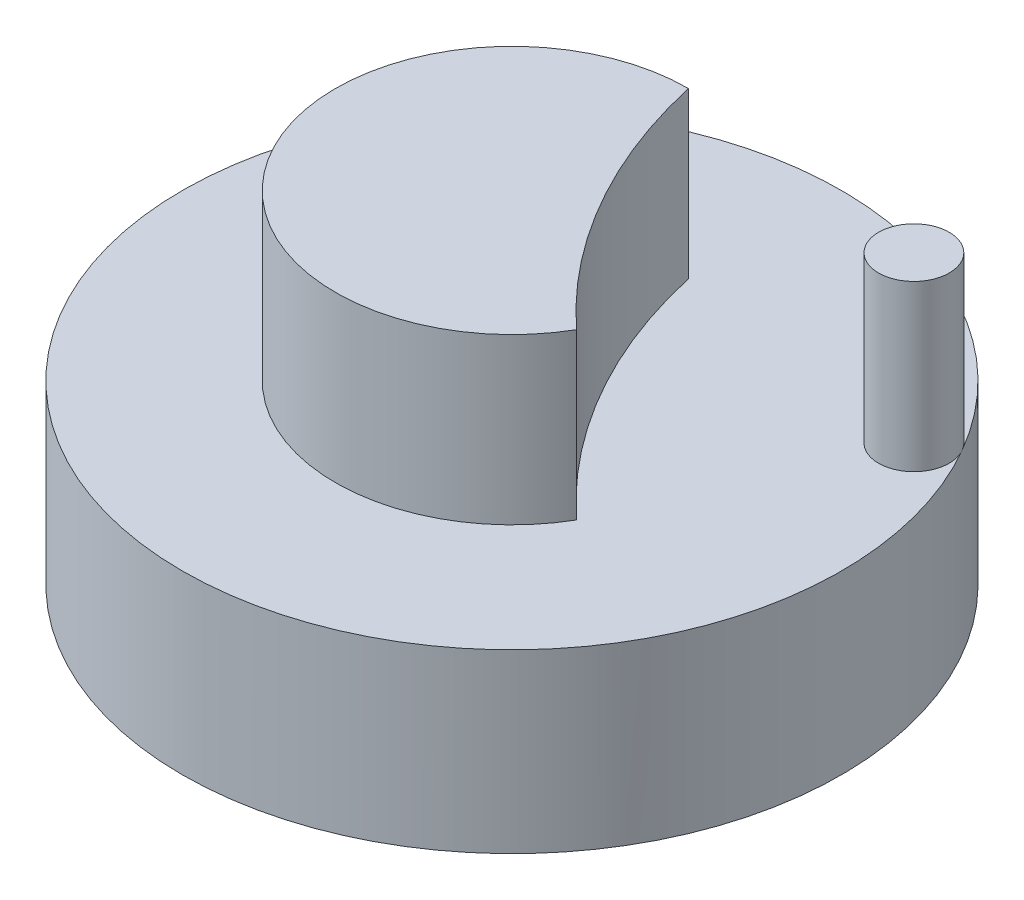
ISO-10303-21;
HEADER;
FILE_DESCRIPTION(('STEP AP214'),'2;1');
FILE_NAME('part.step','',(''),(''),'','','');
FILE_SCHEMA(('AUTOMOTIVE_DESIGN { 1 0 10303 214 1 1 1 1 }'));
ENDSEC;
DATA;
#1=APPLICATION_CONTEXT('core data for automotive mechanical design processes');
#2=APPLICATION_PROTOCOL_DEFINITION('international standard','automotive_design',2000,#1);
#3=PRODUCT_CONTEXT('',#1,'mechanical');
#4=PRODUCT('Part','Part','',(#3));
#5=PRODUCT_RELATED_PRODUCT_CATEGORY('part','',(#4));
#6=PRODUCT_DEFINITION_FORMATION('','',#4);
#7=PRODUCT_DEFINITION_CONTEXT('part definition',#1,'design');
#8=PRODUCT_DEFINITION('design','',#6,#7);
#9=PRODUCT_DEFINITION_SHAPE('','',#8);
#10=(LENGTH_UNIT() NAMED_UNIT(*) SI_UNIT(.MILLI.,.METRE.));
#11=(NAMED_UNIT(*) PLANE_ANGLE_UNIT() SI_UNIT($,.RADIAN.));
#12=(NAMED_UNIT(*) SI_UNIT($,.STERADIAN.) SOLID_ANGLE_UNIT());
#13=UNCERTAINTY_MEASURE_WITH_UNIT(LENGTH_MEASURE(1.E-05),#10,'distance_accuracy_value','');
#14=(GEOMETRIC_REPRESENTATION_CONTEXT(3) GLOBAL_UNCERTAINTY_ASSIGNED_CONTEXT((#13)) GLOBAL_UNIT_ASSIGNED_CONTEXT((#10,
#11,#12)) REPRESENTATION_CONTEXT('',''));
#15=CARTESIAN_POINT('',(0.,0.,0.));
#16=DIRECTION('',(0.,0.,1.));
#17=DIRECTION('',(1.,0.,0.));
#18=AXIS2_PLACEMENT_3D('',#15,#16,#17);
#19=CARTESIAN_POINT('',(84.7241393230111,28.,51.084495355));
#20=DIRECTION('',(0.,-1.,0.));
#21=DIRECTION('',(0.,0.,-1.));
#22=AXIS2_PLACEMENT_3D('',#19,#20,#21);
#23=CYLINDRICAL_SURFACE('',#22,86.81);
#24=CARTESIAN_POINT('',(84.7241393230111,0.,51.084495355));
#25=DIRECTION('',(0.,1.,0.));
#26=DIRECTION('',(0.,0.,1.));
#27=AXIS2_PLACEMENT_3D('',#24,#25,#26);
#28=CIRCLE('',#27,86.81);
#29=CARTESIAN_POINT('',(0.,0.,70.));
#30=VERTEX_POINT('',#29);
#31=CARTESIAN_POINT('',(25.9807621135332,0.,115.));
#32=VERTEX_POINT('',#31);
#33=EDGE_CURVE('E77',#30,#32,#28,.T.);
#34=ORIENTED_EDGE('',*,*,#33,.F.);
#35=DIRECTION('',(0.,-1.,0.));
#36=VECTOR('',#35,1.);
#37=CARTESIAN_POINT('',(0.,28.,70.));
#38=LINE('',#37,#36);
#39=CARTESIAN_POINT('',(0.,28.,70.));
#40=VERTEX_POINT('',#39);
#41=EDGE_CURVE('E11',#40,#30,#38,.T.);
#42=ORIENTED_EDGE('',*,*,#41,.F.);
#43=CARTESIAN_POINT('',(84.7241393230111,28.,51.084495355));
#44=DIRECTION('',(0.,1.,0.));
#45=DIRECTION('',(0.,0.,1.));
#46=AXIS2_PLACEMENT_3D('',#43,#44,#45);
#47=CIRCLE('',#46,86.81);
#48=CARTESIAN_POINT('',(25.9807621135332,28.,115.));
#49=VERTEX_POINT('',#48);
#50=EDGE_CURVE('E83',#40,#49,#47,.T.);
#51=ORIENTED_EDGE('',*,*,#50,.T.);
#52=DIRECTION('',(0.,-1.,0.));
#53=VECTOR('',#52,1.);
#54=CARTESIAN_POINT('',(25.9807621135332,28.,115.));
#55=LINE('',#54,#53);
#56=EDGE_CURVE('E54',#49,#32,#55,.T.);
#57=ORIENTED_EDGE('',*,*,#56,.T.);
#58=EDGE_LOOP('',(#34,#42,#51,#57));
#59=FACE_BOUND('',#58,.T.);
#60=ADVANCED_FACE('F47',(#59),#23,.F.);
#61=CARTESIAN_POINT('',(0.,28.,100.));
#62=DIRECTION('',(0.,-1.,0.));
#63=DIRECTION('',(0.,0.,-1.));
#64=AXIS2_PLACEMENT_3D('',#61,#62,#63);
#65=CYLINDRICAL_SURFACE('',#64,30.);
#66=CARTESIAN_POINT('',(0.,0.,100.));
#67=DIRECTION('',(0.,1.,0.));
#68=DIRECTION('',(0.,0.,1.));
#69=AXIS2_PLACEMENT_3D('',#66,#67,#68);
#70=CIRCLE('',#69,30.);
#71=EDGE_CURVE('E80',#30,#32,#70,.T.);
#72=ORIENTED_EDGE('',*,*,#71,.T.);
#73=ORIENTED_EDGE('',*,*,#56,.F.);
#74=CARTESIAN_POINT('',(0.,28.,100.));
#75=DIRECTION('',(0.,1.,0.));
#76=DIRECTION('',(0.,0.,1.));
#77=AXIS2_PLACEMENT_3D('',#74,#75,#76);
#78=CIRCLE('',#77,30.);
#79=EDGE_CURVE('E66',#40,#49,#78,.T.);
#80=ORIENTED_EDGE('',*,*,#79,.F.);
#81=ORIENTED_EDGE('',*,*,#41,.T.);
#82=EDGE_LOOP('',(#72,#73,#80,#81));
#83=FACE_BOUND('',#82,.T.);
#84=ADVANCED_FACE('F85',(#83),#65,.T.);
#85=CARTESIAN_POINT('',(0.,28.,0.));
#86=DIRECTION('',(0.,1.,0.));
#87=DIRECTION('',(0.,0.,1.));
#88=AXIS2_PLACEMENT_3D('',#85,#86,#87);
#89=PLANE('',#88);
#90=ORIENTED_EDGE('',*,*,#50,.F.);
#91=ORIENTED_EDGE('',*,*,#79,.T.);
#92=EDGE_LOOP('',(#90,#91));
#93=FACE_BOUND('',#92,.T.);
#94=ADVANCED_FACE('F132',(#93),#89,.T.);
#95=CARTESIAN_POINT('',(0.,0.,100.));
#96=DIRECTION('',(0.,1.,0.));
#97=DIRECTION('',(0.,0.,1.));
#98=AXIS2_PLACEMENT_3D('',#95,#96,#97);
#99=PLANE('',#98);
#100=CARTESIAN_POINT('',(0.,0.,100.));
#101=DIRECTION('',(0.,1.,0.));
#102=DIRECTION('',(0.,0.,1.));
#103=AXIS2_PLACEMENT_3D('',#100,#101,#102);
#104=CIRCLE('',#103,56.0000000000003);
#105=CARTESIAN_POINT('',(48.4974226119286,0.,71.9999999999996));
#106=VERTEX_POINT('',#105);
#107=EDGE_CURVE('E91',#106,#106,#104,.T.);
#108=ORIENTED_EDGE('',*,*,#107,.T.);
#109=CARTESIAN_POINT('',(43.3012701892218,0.,74.9999999999997));
#110=DIRECTION('',(0.,1.,0.));
#111=DIRECTION('',(0.,0.,1.));
#112=AXIS2_PLACEMENT_3D('',#109,#110,#111);
#113=CIRCLE('',#112,5.99999999999997);
#114=EDGE_CURVE('E59',#106,#106,#113,.T.);
#115=ORIENTED_EDGE('',*,*,#114,.F.);
#116=EDGE_LOOP('',(#108,#115));
#117=FACE_BOUND('',#116,.T.);
#118=ORIENTED_EDGE('',*,*,#71,.F.);
#119=ORIENTED_EDGE('',*,*,#33,.T.);
#120=EDGE_LOOP('',(#118,#119));
#121=FACE_BOUND('',#120,.T.);
#122=ADVANCED_FACE('F81',(#117,#121),#99,.T.);
#123=CARTESIAN_POINT('',(0.,-30.,100.));
#124=DIRECTION('',(0.,1.,0.));
#125=DIRECTION('',(0.,0.,1.));
#126=AXIS2_PLACEMENT_3D('',#123,#124,#125);
#127=CYLINDRICAL_SURFACE('',#126,56.0000000000003);
#128=CARTESIAN_POINT('',(0.,-30.,100.));
#129=DIRECTION('',(0.,1.,0.));
#130=DIRECTION('',(0.,0.,1.));
#131=AXIS2_PLACEMENT_3D('',#128,#129,#130);
#132=CIRCLE('',#131,56.0000000000003);
#133=CARTESIAN_POINT('',(0.,-30.,156.));
#134=VERTEX_POINT('',#133);
#135=EDGE_CURVE('E88',#134,#134,#132,.T.);
#136=ORIENTED_EDGE('',*,*,#135,.T.);
#137=EDGE_LOOP('',(#136));
#138=FACE_BOUND('',#137,.T.);
#139=ORIENTED_EDGE('',*,*,#107,.F.);
#140=EDGE_LOOP('',(#139));
#141=FACE_BOUND('',#140,.T.);
#142=ADVANCED_FACE('F122',(#138,#141),#127,.T.);
#143=CARTESIAN_POINT('',(0.,-30.,100.));
#144=DIRECTION('',(0.,1.,0.));
#145=DIRECTION('',(0.,0.,1.));
#146=AXIS2_PLACEMENT_3D('',#143,#144,#145);
#147=PLANE('',#146);
#148=CARTESIAN_POINT('',(0.,-30.,100.));
#149=DIRECTION('',(0.,-1.,0.));
#150=DIRECTION('',(0.,0.,-1.));
#151=AXIS2_PLACEMENT_3D('',#148,#149,#150);
#152=CIRCLE('',#151,15.);
#153=CARTESIAN_POINT('',(0.,-30.,85.));
#154=VERTEX_POINT('',#153);
#155=EDGE_CURVE('E103',#154,#154,#152,.T.);
#156=ORIENTED_EDGE('',*,*,#155,.F.);
#157=EDGE_LOOP('',(#156));
#158=FACE_BOUND('',#157,.T.);
#159=ORIENTED_EDGE('',*,*,#135,.F.);
#160=EDGE_LOOP('',(#159));
#161=FACE_BOUND('',#160,.T.);
#162=ADVANCED_FACE('F118',(#158,#161),#147,.F.);
#163=CARTESIAN_POINT('',(43.3012701892218,28.,74.9999999999997));
#164=DIRECTION('',(0.,-1.,0.));
#165=DIRECTION('',(0.,0.,-1.));
#166=AXIS2_PLACEMENT_3D('',#163,#164,#165);
#167=CYLINDRICAL_SURFACE('',#166,5.99999999999997);
#168=CARTESIAN_POINT('',(43.3012701892218,28.,74.9999999999997));
#169=DIRECTION('',(0.,1.,0.));
#170=DIRECTION('',(0.,0.,1.));
#171=AXIS2_PLACEMENT_3D('',#168,#169,#170);
#172=CIRCLE('',#171,5.99999999999997);
#173=CARTESIAN_POINT('',(43.3012701892218,28.,80.9999999999997));
#174=VERTEX_POINT('',#173);
#175=EDGE_CURVE('E97',#174,#174,#172,.T.);
#176=ORIENTED_EDGE('',*,*,#175,.F.);
#177=EDGE_LOOP('',(#176));
#178=FACE_BOUND('',#177,.T.);
#179=ORIENTED_EDGE('',*,*,#114,.T.);
#180=EDGE_LOOP('',(#179));
#181=FACE_BOUND('',#180,.T.);
#182=ADVANCED_FACE('F121',(#178,#181),#167,.T.);
#183=CARTESIAN_POINT('',(0.,28.,0.));
#184=DIRECTION('',(0.,1.,0.));
#185=DIRECTION('',(0.,0.,1.));
#186=AXIS2_PLACEMENT_3D('',#183,#184,#185);
#187=PLANE('',#186);
#188=ORIENTED_EDGE('',*,*,#175,.T.);
#189=EDGE_LOOP('',(#188));
#190=FACE_BOUND('',#189,.T.);
#191=ADVANCED_FACE('F114',(#190),#187,.T.);
#192=CARTESIAN_POINT('',(0.,-0.999999999999997,100.));
#193=DIRECTION('',(0.,-1.,0.));
#194=DIRECTION('',(0.,0.,-1.));
#195=AXIS2_PLACEMENT_3D('',#192,#193,#194);
#196=CYLINDRICAL_SURFACE('',#195,15.);
#197=CARTESIAN_POINT('',(0.,-0.999999999999997,100.));
#198=DIRECTION('',(0.,-1.,0.));
#199=DIRECTION('',(0.,0.,-1.));
#200=AXIS2_PLACEMENT_3D('',#197,#198,#199);
#201=CIRCLE('',#200,15.);
#202=CARTESIAN_POINT('',(0.,-0.999999999999997,85.));
#203=VERTEX_POINT('',#202);
#204=EDGE_CURVE('E100',#203,#203,#201,.T.);
#205=CARTESIAN_POINT('',(0.,-0.999999999999997,85.));
#206=CARTESIAN_POINT('',(0.,-1.30208333333333,85.));
#207=CARTESIAN_POINT('',(0.,-1.60416666666666,85.));
#208=CARTESIAN_POINT('',(0.,-2.20833333333333,85.));
#209=CARTESIAN_POINT('',(0.,-2.51041666666666,85.));
#210=CARTESIAN_POINT('',(0.,-3.11458333333333,85.));
#211=CARTESIAN_POINT('',(0.,-3.41666666666666,85.));
#212=CARTESIAN_POINT('',(0.,-4.02083333333333,85.));
#213=CARTESIAN_POINT('',(0.,-4.32291666666666,85.));
#214=CARTESIAN_POINT('',(0.,-4.92708333333333,85.));
#215=CARTESIAN_POINT('',(0.,-5.22916666666666,85.));
#216=CARTESIAN_POINT('',(0.,-5.83333333333333,85.));
#217=CARTESIAN_POINT('',(0.,-6.13541666666666,85.));
#218=CARTESIAN_POINT('',(0.,-6.73958333333333,85.));
#219=CARTESIAN_POINT('',(0.,-7.04166666666667,85.));
#220=CARTESIAN_POINT('',(0.,-7.64583333333333,85.));
#221=CARTESIAN_POINT('',(0.,-7.94791666666666,85.));
#222=CARTESIAN_POINT('',(0.,-8.55208333333333,85.));
#223=CARTESIAN_POINT('',(0.,-8.85416666666666,85.));
#224=CARTESIAN_POINT('',(0.,-9.45833333333333,85.));
#225=CARTESIAN_POINT('',(0.,-9.76041666666666,85.));
#226=CARTESIAN_POINT('',(0.,-10.3645833333333,85.));
#227=CARTESIAN_POINT('',(0.,-10.6666666666667,85.));
#228=CARTESIAN_POINT('',(0.,-11.2708333333333,85.));
#229=CARTESIAN_POINT('',(0.,-11.5729166666667,85.));
#230=CARTESIAN_POINT('',(0.,-12.1770833333333,85.));
#231=CARTESIAN_POINT('',(0.,-12.4791666666667,85.));
#232=CARTESIAN_POINT('',(0.,-13.0833333333333,85.));
#233=CARTESIAN_POINT('',(0.,-13.3854166666667,85.));
#234=CARTESIAN_POINT('',(0.,-13.9895833333333,85.));
#235=CARTESIAN_POINT('',(0.,-14.2916666666667,85.));
#236=CARTESIAN_POINT('',(0.,-14.8958333333333,85.));
#237=CARTESIAN_POINT('',(0.,-15.1979166666667,85.));
#238=CARTESIAN_POINT('',(0.,-15.8020833333333,85.));
#239=CARTESIAN_POINT('',(0.,-16.1041666666667,85.));
#240=CARTESIAN_POINT('',(0.,-16.7083333333333,85.));
#241=CARTESIAN_POINT('',(0.,-17.0104166666667,85.));
#242=CARTESIAN_POINT('',(0.,-17.6145833333333,85.));
#243=CARTESIAN_POINT('',(0.,-17.9166666666667,85.));
#244=CARTESIAN_POINT('',(0.,-18.5208333333333,85.));
#245=CARTESIAN_POINT('',(0.,-18.8229166666667,85.));
#246=CARTESIAN_POINT('',(0.,-19.4270833333333,85.));
#247=CARTESIAN_POINT('',(0.,-19.7291666666667,85.));
#248=CARTESIAN_POINT('',(0.,-20.3333333333333,85.));
#249=CARTESIAN_POINT('',(0.,-20.6354166666667,85.));
#250=CARTESIAN_POINT('',(0.,-21.2395833333333,85.));
#251=CARTESIAN_POINT('',(0.,-21.5416666666667,85.));
#252=CARTESIAN_POINT('',(0.,-22.1458333333333,85.));
#253=CARTESIAN_POINT('',(0.,-22.4479166666667,85.));
#254=CARTESIAN_POINT('',(0.,-23.0520833333333,85.));
#255=CARTESIAN_POINT('',(0.,-23.3541666666667,85.));
#256=CARTESIAN_POINT('',(0.,-23.9583333333333,85.));
#257=CARTESIAN_POINT('',(0.,-24.2604166666667,85.));
#258=CARTESIAN_POINT('',(0.,-24.8645833333333,85.));
#259=CARTESIAN_POINT('',(0.,-25.1666666666667,85.));
#260=CARTESIAN_POINT('',(0.,-25.7708333333333,85.));
#261=CARTESIAN_POINT('',(0.,-26.0729166666667,85.));
#262=CARTESIAN_POINT('',(0.,-26.6770833333333,85.));
#263=CARTESIAN_POINT('',(0.,-26.9791666666667,85.));
#264=CARTESIAN_POINT('',(0.,-27.5833333333333,85.));
#265=CARTESIAN_POINT('',(0.,-27.8854166666667,85.));
#266=CARTESIAN_POINT('',(0.,-28.4895833333333,85.));
#267=CARTESIAN_POINT('',(0.,-28.7916666666667,85.));
#268=CARTESIAN_POINT('',(0.,-29.3958333333333,85.));
#269=CARTESIAN_POINT('',(0.,-29.6979166666667,85.));
#270=CARTESIAN_POINT('',(0.,-30.,85.));
#271=B_SPLINE_CURVE_WITH_KNOTS('',3,(#205,#206,#207,#208,#209,#210,#211,#212,#213,#214,#215,
#216,#217,#218,#219,#220,#221,#222,#223,#224,#225,#226,#227,#228,#229,#230,#231,#232,#233,#234,
#235,#236,#237,#238,#239,#240,#241,#242,#243,#244,#245,#246,#247,#248,#249,#250,#251,#252,#253,
#254,#255,#256,#257,#258,#259,#260,#261,#262,#263,#264,#265,#266,#267,#268,#269,#270),
.UNSPECIFIED.,.F.,.F.,(4,2,2,2,2,2,2,2,2,2,2,2,2,2,2,2,2,2,2,2,2,2,2,2,2,2,2,2,2,2,2,2,4),(0.,
0.90625,1.8125,2.71875,3.625,4.53125,5.4375,6.34375,7.25,8.15625,9.0625,9.96875,10.875,11.78125,
12.6875,13.59375,14.5,15.40625,16.3125,17.21875,18.125,19.03125,19.9375,20.84375,21.75,22.65625,
23.5625,24.46875,25.375,26.28125,27.1875,28.09375,29.),.UNSPECIFIED.);
#272=EDGE_CURVE('BSEAM111',#203,#154,#271,.T.);
#273=ORIENTED_EDGE('',*,*,#204,.F.);
#274=ORIENTED_EDGE('',*,*,#155,.T.);
#275=ORIENTED_EDGE('',*,*,#272,.T.);
#276=ORIENTED_EDGE('',*,*,#272,.F.);
#277=EDGE_LOOP('',(#273,#275,#274,#276));
#278=FACE_BOUND('',#277,.T.);
#279=ADVANCED_FACE('F111',(#278),#196,.F.);
#280=CARTESIAN_POINT('',(0.,-0.999999999999997,100.));
#281=DIRECTION('',(0.,-1.,0.));
#282=DIRECTION('',(0.,0.,-1.));
#283=AXIS2_PLACEMENT_3D('',#280,#281,#282);
#284=PLANE('',#283);
#285=ORIENTED_EDGE('',*,*,#204,.T.);
#286=EDGE_LOOP('',(#285));
#287=FACE_BOUND('',#286,.T.);
#288=ADVANCED_FACE('F109',(#287),#284,.T.);
#289=CLOSED_SHELL('',(#60,#84,#94,#122,#142,#162,#182,#191,#279,#288));
#290=MANIFOLD_SOLID_BREP('B2',#289);
#291=ADVANCED_BREP_SHAPE_REPRESENTATION('',(#18,#290),#14);
#292=SHAPE_DEFINITION_REPRESENTATION(#9,#291);
ENDSEC;
END-ISO-10303-21;
